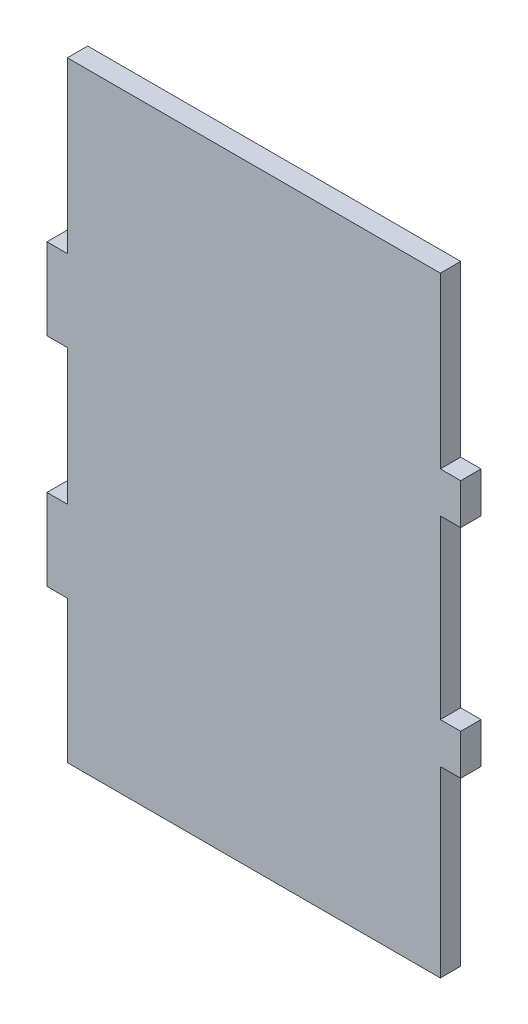
ISO-10303-21;
HEADER;
FILE_DESCRIPTION(('STEP AP214'),'2;1');
FILE_NAME('part.step','',(''),(''),'','','');
FILE_SCHEMA(('AUTOMOTIVE_DESIGN { 1 0 10303 214 1 1 1 1 }'));
ENDSEC;
DATA;
#1=APPLICATION_CONTEXT('core data for automotive mechanical design processes');
#2=APPLICATION_PROTOCOL_DEFINITION('international standard','automotive_design',2000,#1);
#3=PRODUCT_CONTEXT('',#1,'mechanical');
#4=PRODUCT('Part','Part','',(#3));
#5=PRODUCT_RELATED_PRODUCT_CATEGORY('part','',(#4));
#6=PRODUCT_DEFINITION_FORMATION('','',#4);
#7=PRODUCT_DEFINITION_CONTEXT('part definition',#1,'design');
#8=PRODUCT_DEFINITION('design','',#6,#7);
#9=PRODUCT_DEFINITION_SHAPE('','',#8);
#10=(LENGTH_UNIT() NAMED_UNIT(*) SI_UNIT(.MILLI.,.METRE.));
#11=(NAMED_UNIT(*) PLANE_ANGLE_UNIT() SI_UNIT($,.RADIAN.));
#12=(NAMED_UNIT(*) SI_UNIT($,.STERADIAN.) SOLID_ANGLE_UNIT());
#13=UNCERTAINTY_MEASURE_WITH_UNIT(LENGTH_MEASURE(1.E-05),#10,'distance_accuracy_value','');
#14=(GEOMETRIC_REPRESENTATION_CONTEXT(3) GLOBAL_UNCERTAINTY_ASSIGNED_CONTEXT((#13)) GLOBAL_UNIT_ASSIGNED_CONTEXT((#10,
#11,#12)) REPRESENTATION_CONTEXT('',''));
#15=CARTESIAN_POINT('',(0.,0.,0.));
#16=DIRECTION('',(0.,0.,1.));
#17=DIRECTION('',(1.,0.,0.));
#18=AXIS2_PLACEMENT_3D('',#15,#16,#17);
#19=CARTESIAN_POINT('',(0.,-25.,3.));
#20=DIRECTION('',(0.,-1.,0.));
#21=DIRECTION('',(1.,0.,0.));
#22=AXIS2_PLACEMENT_3D('',#19,#20,#21);
#23=PLANE('',#22);
#24=DIRECTION('',(-1.,0.,0.));
#25=VECTOR('',#24,1.);
#26=CARTESIAN_POINT('',(0.,-25.,0.));
#27=LINE('',#26,#25);
#28=CARTESIAN_POINT('',(0.,-25.,0.));
#29=VERTEX_POINT('',#28);
#30=CARTESIAN_POINT('',(-3.,-25.,0.));
#31=VERTEX_POINT('',#30);
#32=EDGE_CURVE('E207',#29,#31,#27,.T.);
#33=ORIENTED_EDGE('',*,*,#32,.T.);
#34=DIRECTION('',(0.,0.,-1.));
#35=VECTOR('',#34,1.);
#36=CARTESIAN_POINT('',(-3.,-25.,3.));
#37=LINE('',#36,#35);
#38=CARTESIAN_POINT('',(-3.,-25.,3.));
#39=VERTEX_POINT('',#38);
#40=EDGE_CURVE('E11',#39,#31,#37,.T.);
#41=ORIENTED_EDGE('',*,*,#40,.F.);
#42=DIRECTION('',(-1.,0.,0.));
#43=VECTOR('',#42,1.);
#44=CARTESIAN_POINT('',(0.,-25.,3.));
#45=LINE('',#44,#43);
#46=CARTESIAN_POINT('',(0.,-25.,3.));
#47=VERTEX_POINT('',#46);
#48=EDGE_CURVE('E245',#47,#39,#45,.T.);
#49=ORIENTED_EDGE('',*,*,#48,.F.);
#50=DIRECTION('',(0.,0.,-1.));
#51=VECTOR('',#50,1.);
#52=CARTESIAN_POINT('',(0.,-25.,3.));
#53=LINE('',#52,#51);
#54=EDGE_CURVE('E203',#47,#29,#53,.T.);
#55=ORIENTED_EDGE('',*,*,#54,.T.);
#56=EDGE_LOOP('',(#33,#41,#49,#55));
#57=FACE_BOUND('',#56,.T.);
#58=ADVANCED_FACE('F39',(#57),#23,.F.);
#59=CARTESIAN_POINT('',(-3.,-25.,3.));
#60=DIRECTION('',(1.,0.,0.));
#61=DIRECTION('',(0.,1.,0.));
#62=AXIS2_PLACEMENT_3D('',#59,#60,#61);
#63=PLANE('',#62);
#64=DIRECTION('',(0.,-1.,0.));
#65=VECTOR('',#64,1.);
#66=CARTESIAN_POINT('',(-3.,-25.,0.));
#67=LINE('',#66,#65);
#68=CARTESIAN_POINT('',(-3.,-37.,0.));
#69=VERTEX_POINT('',#68);
#70=EDGE_CURVE('E210',#31,#69,#67,.T.);
#71=ORIENTED_EDGE('',*,*,#70,.T.);
#72=DIRECTION('',(0.,0.,-1.));
#73=VECTOR('',#72,1.);
#74=CARTESIAN_POINT('',(-3.,-37.,3.));
#75=LINE('',#74,#73);
#76=CARTESIAN_POINT('',(-3.,-37.,3.));
#77=VERTEX_POINT('',#76);
#78=EDGE_CURVE('E47',#77,#69,#75,.T.);
#79=ORIENTED_EDGE('',*,*,#78,.F.);
#80=DIRECTION('',(0.,-1.,0.));
#81=VECTOR('',#80,1.);
#82=CARTESIAN_POINT('',(-3.,-25.,3.));
#83=LINE('',#82,#81);
#84=EDGE_CURVE('E134',#39,#77,#83,.T.);
#85=ORIENTED_EDGE('',*,*,#84,.F.);
#86=ORIENTED_EDGE('',*,*,#40,.T.);
#87=EDGE_LOOP('',(#71,#79,#85,#86));
#88=FACE_BOUND('',#87,.T.);
#89=ADVANCED_FACE('F363',(#88),#63,.F.);
#90=CARTESIAN_POINT('',(0.,-37.,3.));
#91=DIRECTION('',(0.,1.,0.));
#92=DIRECTION('',(-1.,0.,0.));
#93=AXIS2_PLACEMENT_3D('',#90,#91,#92);
#94=PLANE('',#93);
#95=DIRECTION('',(1.,0.,0.));
#96=VECTOR('',#95,1.);
#97=CARTESIAN_POINT('',(0.,-37.,0.));
#98=LINE('',#97,#96);
#99=CARTESIAN_POINT('',(0.,-37.,0.));
#100=VERTEX_POINT('',#99);
#101=EDGE_CURVE('E212',#69,#100,#98,.T.);
#102=ORIENTED_EDGE('',*,*,#101,.T.);
#103=DIRECTION('',(0.,0.,-1.));
#104=VECTOR('',#103,1.);
#105=CARTESIAN_POINT('',(0.,-37.,3.));
#106=LINE('',#105,#104);
#107=CARTESIAN_POINT('',(0.,-37.,3.));
#108=VERTEX_POINT('',#107);
#109=EDGE_CURVE('E288',#108,#100,#106,.T.);
#110=ORIENTED_EDGE('',*,*,#109,.F.);
#111=DIRECTION('',(1.,0.,0.));
#112=VECTOR('',#111,1.);
#113=CARTESIAN_POINT('',(0.,-37.,3.));
#114=LINE('',#113,#112);
#115=EDGE_CURVE('E296',#77,#108,#114,.T.);
#116=ORIENTED_EDGE('',*,*,#115,.F.);
#117=ORIENTED_EDGE('',*,*,#78,.T.);
#118=EDGE_LOOP('',(#102,#110,#116,#117));
#119=FACE_BOUND('',#118,.T.);
#120=ADVANCED_FACE('F294',(#119),#94,.F.);
#121=CARTESIAN_POINT('',(0.,-37.,3.));
#122=DIRECTION('',(1.,0.,0.));
#123=DIRECTION('',(0.,1.,0.));
#124=AXIS2_PLACEMENT_3D('',#121,#122,#123);
#125=PLANE('',#124);
#126=DIRECTION('',(0.,-1.,0.));
#127=VECTOR('',#126,1.);
#128=CARTESIAN_POINT('',(0.,-37.,0.));
#129=LINE('',#128,#127);
#130=CARTESIAN_POINT('',(0.,-57.,0.));
#131=VERTEX_POINT('',#130);
#132=EDGE_CURVE('E214',#100,#131,#129,.T.);
#133=ORIENTED_EDGE('',*,*,#132,.T.);
#134=DIRECTION('',(0.,0.,-1.));
#135=VECTOR('',#134,1.);
#136=CARTESIAN_POINT('',(0.,-57.,3.));
#137=LINE('',#136,#135);
#138=CARTESIAN_POINT('',(0.,-57.,3.));
#139=VERTEX_POINT('',#138);
#140=EDGE_CURVE('E285',#139,#131,#137,.T.);
#141=ORIENTED_EDGE('',*,*,#140,.F.);
#142=DIRECTION('',(0.,-1.,0.));
#143=VECTOR('',#142,1.);
#144=CARTESIAN_POINT('',(0.,-37.,3.));
#145=LINE('',#144,#143);
#146=EDGE_CURVE('E314',#108,#139,#145,.T.);
#147=ORIENTED_EDGE('',*,*,#146,.F.);
#148=ORIENTED_EDGE('',*,*,#109,.T.);
#149=EDGE_LOOP('',(#133,#141,#147,#148));
#150=FACE_BOUND('',#149,.T.);
#151=ADVANCED_FACE('F305',(#150),#125,.F.);
#152=CARTESIAN_POINT('',(0.,-57.,3.));
#153=DIRECTION('',(0.,-1.,0.));
#154=DIRECTION('',(1.,0.,0.));
#155=AXIS2_PLACEMENT_3D('',#152,#153,#154);
#156=PLANE('',#155);
#157=DIRECTION('',(-1.,0.,0.));
#158=VECTOR('',#157,1.);
#159=CARTESIAN_POINT('',(0.,-57.,0.));
#160=LINE('',#159,#158);
#161=CARTESIAN_POINT('',(-3.,-57.,0.));
#162=VERTEX_POINT('',#161);
#163=EDGE_CURVE('E216',#131,#162,#160,.T.);
#164=ORIENTED_EDGE('',*,*,#163,.T.);
#165=DIRECTION('',(0.,0.,-1.));
#166=VECTOR('',#165,1.);
#167=CARTESIAN_POINT('',(-3.,-57.,3.));
#168=LINE('',#167,#166);
#169=CARTESIAN_POINT('',(-3.,-57.,3.));
#170=VERTEX_POINT('',#169);
#171=EDGE_CURVE('E282',#170,#162,#168,.T.);
#172=ORIENTED_EDGE('',*,*,#171,.F.);
#173=DIRECTION('',(-1.,0.,0.));
#174=VECTOR('',#173,1.);
#175=CARTESIAN_POINT('',(0.,-57.,3.));
#176=LINE('',#175,#174);
#177=EDGE_CURVE('E311',#139,#170,#176,.T.);
#178=ORIENTED_EDGE('',*,*,#177,.F.);
#179=ORIENTED_EDGE('',*,*,#140,.T.);
#180=EDGE_LOOP('',(#164,#172,#178,#179));
#181=FACE_BOUND('',#180,.T.);
#182=ADVANCED_FACE('F309',(#181),#156,.F.);
#183=CARTESIAN_POINT('',(-3.,-57.,3.));
#184=DIRECTION('',(1.,0.,0.));
#185=DIRECTION('',(0.,1.,0.));
#186=AXIS2_PLACEMENT_3D('',#183,#184,#185);
#187=PLANE('',#186);
#188=DIRECTION('',(0.,-1.,0.));
#189=VECTOR('',#188,1.);
#190=CARTESIAN_POINT('',(-3.,-57.,0.));
#191=LINE('',#190,#189);
#192=CARTESIAN_POINT('',(-2.99999999999999,-69.,0.));
#193=VERTEX_POINT('',#192);
#194=EDGE_CURVE('E218',#162,#193,#191,.T.);
#195=ORIENTED_EDGE('',*,*,#194,.T.);
#196=DIRECTION('',(0.,0.,-1.));
#197=VECTOR('',#196,1.);
#198=CARTESIAN_POINT('',(-2.99999999999999,-69.,3.));
#199=LINE('',#198,#197);
#200=CARTESIAN_POINT('',(-2.99999999999999,-69.,3.));
#201=VERTEX_POINT('',#200);
#202=EDGE_CURVE('E279',#201,#193,#199,.T.);
#203=ORIENTED_EDGE('',*,*,#202,.F.);
#204=DIRECTION('',(0.,-1.,0.));
#205=VECTOR('',#204,1.);
#206=CARTESIAN_POINT('',(-3.,-57.,3.));
#207=LINE('',#206,#205);
#208=EDGE_CURVE('E313',#170,#201,#207,.T.);
#209=ORIENTED_EDGE('',*,*,#208,.F.);
#210=ORIENTED_EDGE('',*,*,#171,.T.);
#211=EDGE_LOOP('',(#195,#203,#209,#210));
#212=FACE_BOUND('',#211,.T.);
#213=ADVANCED_FACE('F376',(#212),#187,.F.);
#214=CARTESIAN_POINT('',(0.,-69.,3.));
#215=DIRECTION('',(0.,1.,0.));
#216=DIRECTION('',(-1.,0.,0.));
#217=AXIS2_PLACEMENT_3D('',#214,#215,#216);
#218=PLANE('',#217);
#219=DIRECTION('',(1.,0.,0.));
#220=VECTOR('',#219,1.);
#221=CARTESIAN_POINT('',(0.,-69.,0.));
#222=LINE('',#221,#220);
#223=CARTESIAN_POINT('',(0.,-69.,0.));
#224=VERTEX_POINT('',#223);
#225=EDGE_CURVE('E220',#193,#224,#222,.T.);
#226=ORIENTED_EDGE('',*,*,#225,.T.);
#227=DIRECTION('',(0.,0.,-1.));
#228=VECTOR('',#227,1.);
#229=CARTESIAN_POINT('',(0.,-69.,3.));
#230=LINE('',#229,#228);
#231=CARTESIAN_POINT('',(0.,-69.,3.));
#232=VERTEX_POINT('',#231);
#233=EDGE_CURVE('E276',#232,#224,#230,.T.);
#234=ORIENTED_EDGE('',*,*,#233,.F.);
#235=DIRECTION('',(1.,0.,0.));
#236=VECTOR('',#235,1.);
#237=CARTESIAN_POINT('',(0.,-69.,3.));
#238=LINE('',#237,#236);
#239=EDGE_CURVE('E316',#201,#232,#238,.T.);
#240=ORIENTED_EDGE('',*,*,#239,.F.);
#241=ORIENTED_EDGE('',*,*,#202,.T.);
#242=EDGE_LOOP('',(#226,#234,#240,#241));
#243=FACE_BOUND('',#242,.T.);
#244=ADVANCED_FACE('F379',(#243),#218,.F.);
#245=CARTESIAN_POINT('',(0.,-69.,3.));
#246=DIRECTION('',(1.,0.,0.));
#247=DIRECTION('',(0.,1.,0.));
#248=AXIS2_PLACEMENT_3D('',#245,#246,#247);
#249=PLANE('',#248);
#250=DIRECTION('',(0.,-1.,0.));
#251=VECTOR('',#250,1.);
#252=CARTESIAN_POINT('',(0.,-69.,0.));
#253=LINE('',#252,#251);
#254=CARTESIAN_POINT('',(0.,-90.,0.));
#255=VERTEX_POINT('',#254);
#256=EDGE_CURVE('E222',#224,#255,#253,.T.);
#257=ORIENTED_EDGE('',*,*,#256,.T.);
#258=DIRECTION('',(0.,0.,-1.));
#259=VECTOR('',#258,1.);
#260=CARTESIAN_POINT('',(0.,-90.,3.));
#261=LINE('',#260,#259);
#262=CARTESIAN_POINT('',(0.,-90.,3.));
#263=VERTEX_POINT('',#262);
#264=EDGE_CURVE('E273',#263,#255,#261,.T.);
#265=ORIENTED_EDGE('',*,*,#264,.F.);
#266=DIRECTION('',(0.,-1.,0.));
#267=VECTOR('',#266,1.);
#268=CARTESIAN_POINT('',(0.,-69.,3.));
#269=LINE('',#268,#267);
#270=EDGE_CURVE('E322',#232,#263,#269,.T.);
#271=ORIENTED_EDGE('',*,*,#270,.F.);
#272=ORIENTED_EDGE('',*,*,#233,.T.);
#273=EDGE_LOOP('',(#257,#265,#271,#272));
#274=FACE_BOUND('',#273,.T.);
#275=ADVANCED_FACE('F383',(#274),#249,.F.);
#276=CARTESIAN_POINT('',(0.,-90.,3.));
#277=DIRECTION('',(0.,1.,0.));
#278=DIRECTION('',(0.,0.,1.));
#279=AXIS2_PLACEMENT_3D('',#276,#277,#278);
#280=PLANE('',#279);
#281=DIRECTION('',(1.,0.,0.));
#282=VECTOR('',#281,1.);
#283=CARTESIAN_POINT('',(0.,-90.,0.));
#284=LINE('',#283,#282);
#285=CARTESIAN_POINT('',(55.,-90.,0.));
#286=VERTEX_POINT('',#285);
#287=EDGE_CURVE('E224',#255,#286,#284,.T.);
#288=ORIENTED_EDGE('',*,*,#287,.T.);
#289=DIRECTION('',(0.,0.,-1.));
#290=VECTOR('',#289,1.);
#291=CARTESIAN_POINT('',(55.,-90.,3.));
#292=LINE('',#291,#290);
#293=CARTESIAN_POINT('',(55.,-90.,3.));
#294=VERTEX_POINT('',#293);
#295=EDGE_CURVE('E270',#294,#286,#292,.T.);
#296=ORIENTED_EDGE('',*,*,#295,.F.);
#297=DIRECTION('',(1.,0.,0.));
#298=VECTOR('',#297,1.);
#299=CARTESIAN_POINT('',(0.,-90.,3.));
#300=LINE('',#299,#298);
#301=EDGE_CURVE('E324',#263,#294,#300,.T.);
#302=ORIENTED_EDGE('',*,*,#301,.F.);
#303=ORIENTED_EDGE('',*,*,#264,.T.);
#304=EDGE_LOOP('',(#288,#296,#302,#303));
#305=FACE_BOUND('',#304,.T.);
#306=ADVANCED_FACE('F387',(#305),#280,.F.);
#307=CARTESIAN_POINT('',(55.,-63.,3.));
#308=DIRECTION('',(-1.,0.,0.));
#309=DIRECTION('',(0.,0.,1.));
#310=AXIS2_PLACEMENT_3D('',#307,#308,#309);
#311=PLANE('',#310);
#312=DIRECTION('',(0.,1.,0.));
#313=VECTOR('',#312,1.);
#314=CARTESIAN_POINT('',(55.,-63.,0.));
#315=LINE('',#314,#313);
#316=CARTESIAN_POINT('',(55.,-63.,0.));
#317=VERTEX_POINT('',#316);
#318=EDGE_CURVE('E226',#286,#317,#315,.T.);
#319=ORIENTED_EDGE('',*,*,#318,.T.);
#320=DIRECTION('',(0.,0.,-1.));
#321=VECTOR('',#320,1.);
#322=CARTESIAN_POINT('',(55.,-63.,3.));
#323=LINE('',#322,#321);
#324=CARTESIAN_POINT('',(55.,-63.,3.));
#325=VERTEX_POINT('',#324);
#326=EDGE_CURVE('E267',#325,#317,#323,.T.);
#327=ORIENTED_EDGE('',*,*,#326,.F.);
#328=DIRECTION('',(0.,1.,0.));
#329=VECTOR('',#328,1.);
#330=CARTESIAN_POINT('',(55.,-63.,3.));
#331=LINE('',#330,#329);
#332=EDGE_CURVE('E326',#294,#325,#331,.T.);
#333=ORIENTED_EDGE('',*,*,#332,.F.);
#334=ORIENTED_EDGE('',*,*,#295,.T.);
#335=EDGE_LOOP('',(#319,#327,#333,#334));
#336=FACE_BOUND('',#335,.T.);
#337=ADVANCED_FACE('F391',(#336),#311,.F.);
#338=CARTESIAN_POINT('',(55.,-63.,3.));
#339=DIRECTION('',(0.,1.,0.));
#340=DIRECTION('',(0.,0.,1.));
#341=AXIS2_PLACEMENT_3D('',#338,#339,#340);
#342=PLANE('',#341);
#343=DIRECTION('',(1.,0.,0.));
#344=VECTOR('',#343,1.);
#345=CARTESIAN_POINT('',(55.,-63.,0.));
#346=LINE('',#345,#344);
#347=CARTESIAN_POINT('',(58.,-63.,0.));
#348=VERTEX_POINT('',#347);
#349=EDGE_CURVE('E228',#317,#348,#346,.T.);
#350=ORIENTED_EDGE('',*,*,#349,.T.);
#351=DIRECTION('',(0.,0.,-1.));
#352=VECTOR('',#351,1.);
#353=CARTESIAN_POINT('',(58.,-63.,3.));
#354=LINE('',#353,#352);
#355=CARTESIAN_POINT('',(58.,-63.,3.));
#356=VERTEX_POINT('',#355);
#357=EDGE_CURVE('E264',#356,#348,#354,.T.);
#358=ORIENTED_EDGE('',*,*,#357,.F.);
#359=DIRECTION('',(1.,0.,0.));
#360=VECTOR('',#359,1.);
#361=CARTESIAN_POINT('',(55.,-63.,3.));
#362=LINE('',#361,#360);
#363=EDGE_CURVE('E328',#325,#356,#362,.T.);
#364=ORIENTED_EDGE('',*,*,#363,.F.);
#365=ORIENTED_EDGE('',*,*,#326,.T.);
#366=EDGE_LOOP('',(#350,#358,#364,#365));
#367=FACE_BOUND('',#366,.T.);
#368=ADVANCED_FACE('F395',(#367),#342,.F.);
#369=CARTESIAN_POINT('',(58.,-57.,3.));
#370=DIRECTION('',(-1.,0.,0.));
#371=DIRECTION('',(0.,0.,1.));
#372=AXIS2_PLACEMENT_3D('',#369,#370,#371);
#373=PLANE('',#372);
#374=DIRECTION('',(0.,1.,0.));
#375=VECTOR('',#374,1.);
#376=CARTESIAN_POINT('',(58.,-57.,0.));
#377=LINE('',#376,#375);
#378=CARTESIAN_POINT('',(58.,-57.,0.));
#379=VERTEX_POINT('',#378);
#380=EDGE_CURVE('E230',#348,#379,#377,.T.);
#381=ORIENTED_EDGE('',*,*,#380,.T.);
#382=DIRECTION('',(0.,0.,-1.));
#383=VECTOR('',#382,1.);
#384=CARTESIAN_POINT('',(58.,-57.,3.));
#385=LINE('',#384,#383);
#386=CARTESIAN_POINT('',(58.,-57.,3.));
#387=VERTEX_POINT('',#386);
#388=EDGE_CURVE('E261',#387,#379,#385,.T.);
#389=ORIENTED_EDGE('',*,*,#388,.F.);
#390=DIRECTION('',(0.,1.,0.));
#391=VECTOR('',#390,1.);
#392=CARTESIAN_POINT('',(58.,-57.,3.));
#393=LINE('',#392,#391);
#394=EDGE_CURVE('E330',#356,#387,#393,.T.);
#395=ORIENTED_EDGE('',*,*,#394,.F.);
#396=ORIENTED_EDGE('',*,*,#357,.T.);
#397=EDGE_LOOP('',(#381,#389,#395,#396));
#398=FACE_BOUND('',#397,.T.);
#399=ADVANCED_FACE('F399',(#398),#373,.F.);
#400=CARTESIAN_POINT('',(55.,-57.,3.));
#401=DIRECTION('',(0.,-1.,0.));
#402=DIRECTION('',(0.,0.,-1.));
#403=AXIS2_PLACEMENT_3D('',#400,#401,#402);
#404=PLANE('',#403);
#405=DIRECTION('',(-1.,0.,0.));
#406=VECTOR('',#405,1.);
#407=CARTESIAN_POINT('',(55.,-57.,0.));
#408=LINE('',#407,#406);
#409=CARTESIAN_POINT('',(55.,-57.,0.));
#410=VERTEX_POINT('',#409);
#411=EDGE_CURVE('E232',#379,#410,#408,.T.);
#412=ORIENTED_EDGE('',*,*,#411,.T.);
#413=DIRECTION('',(0.,0.,-1.));
#414=VECTOR('',#413,1.);
#415=CARTESIAN_POINT('',(55.,-57.,3.));
#416=LINE('',#415,#414);
#417=CARTESIAN_POINT('',(55.,-57.,3.));
#418=VERTEX_POINT('',#417);
#419=EDGE_CURVE('E258',#418,#410,#416,.T.);
#420=ORIENTED_EDGE('',*,*,#419,.F.);
#421=DIRECTION('',(-1.,0.,0.));
#422=VECTOR('',#421,1.);
#423=CARTESIAN_POINT('',(55.,-57.,3.));
#424=LINE('',#423,#422);
#425=EDGE_CURVE('E332',#387,#418,#424,.T.);
#426=ORIENTED_EDGE('',*,*,#425,.F.);
#427=ORIENTED_EDGE('',*,*,#388,.T.);
#428=EDGE_LOOP('',(#412,#420,#426,#427));
#429=FACE_BOUND('',#428,.T.);
#430=ADVANCED_FACE('F403',(#429),#404,.F.);
#431=CARTESIAN_POINT('',(55.,-31.,3.));
#432=DIRECTION('',(-1.,0.,0.));
#433=DIRECTION('',(0.,0.,1.));
#434=AXIS2_PLACEMENT_3D('',#431,#432,#433);
#435=PLANE('',#434);
#436=DIRECTION('',(0.,1.,0.));
#437=VECTOR('',#436,1.);
#438=CARTESIAN_POINT('',(55.,-31.,0.));
#439=LINE('',#438,#437);
#440=CARTESIAN_POINT('',(55.,-31.,0.));
#441=VERTEX_POINT('',#440);
#442=EDGE_CURVE('E234',#410,#441,#439,.T.);
#443=ORIENTED_EDGE('',*,*,#442,.T.);
#444=DIRECTION('',(0.,0.,-1.));
#445=VECTOR('',#444,1.);
#446=CARTESIAN_POINT('',(55.,-31.,3.));
#447=LINE('',#446,#445);
#448=CARTESIAN_POINT('',(55.,-31.,3.));
#449=VERTEX_POINT('',#448);
#450=EDGE_CURVE('E255',#449,#441,#447,.T.);
#451=ORIENTED_EDGE('',*,*,#450,.F.);
#452=DIRECTION('',(0.,1.,0.));
#453=VECTOR('',#452,1.);
#454=CARTESIAN_POINT('',(55.,-31.,3.));
#455=LINE('',#454,#453);
#456=EDGE_CURVE('E334',#418,#449,#455,.T.);
#457=ORIENTED_EDGE('',*,*,#456,.F.);
#458=ORIENTED_EDGE('',*,*,#419,.T.);
#459=EDGE_LOOP('',(#443,#451,#457,#458));
#460=FACE_BOUND('',#459,.T.);
#461=ADVANCED_FACE('F407',(#460),#435,.F.);
#462=CARTESIAN_POINT('',(55.,-31.,3.));
#463=DIRECTION('',(0.,1.,0.));
#464=DIRECTION('',(0.,0.,1.));
#465=AXIS2_PLACEMENT_3D('',#462,#463,#464);
#466=PLANE('',#465);
#467=DIRECTION('',(1.,0.,0.));
#468=VECTOR('',#467,1.);
#469=CARTESIAN_POINT('',(55.,-31.,0.));
#470=LINE('',#469,#468);
#471=CARTESIAN_POINT('',(58.,-31.,0.));
#472=VERTEX_POINT('',#471);
#473=EDGE_CURVE('E236',#441,#472,#470,.T.);
#474=ORIENTED_EDGE('',*,*,#473,.T.);
#475=DIRECTION('',(0.,0.,-1.));
#476=VECTOR('',#475,1.);
#477=CARTESIAN_POINT('',(58.,-31.,3.));
#478=LINE('',#477,#476);
#479=CARTESIAN_POINT('',(58.,-31.,3.));
#480=VERTEX_POINT('',#479);
#481=EDGE_CURVE('E252',#480,#472,#478,.T.);
#482=ORIENTED_EDGE('',*,*,#481,.F.);
#483=DIRECTION('',(1.,0.,0.));
#484=VECTOR('',#483,1.);
#485=CARTESIAN_POINT('',(55.,-31.,3.));
#486=LINE('',#485,#484);
#487=EDGE_CURVE('E336',#449,#480,#486,.T.);
#488=ORIENTED_EDGE('',*,*,#487,.F.);
#489=ORIENTED_EDGE('',*,*,#450,.T.);
#490=EDGE_LOOP('',(#474,#482,#488,#489));
#491=FACE_BOUND('',#490,.T.);
#492=ADVANCED_FACE('F411',(#491),#466,.F.);
#493=CARTESIAN_POINT('',(58.,-25.,3.));
#494=DIRECTION('',(-1.,0.,0.));
#495=DIRECTION('',(0.,0.,1.));
#496=AXIS2_PLACEMENT_3D('',#493,#494,#495);
#497=PLANE('',#496);
#498=DIRECTION('',(0.,1.,0.));
#499=VECTOR('',#498,1.);
#500=CARTESIAN_POINT('',(58.,-25.,0.));
#501=LINE('',#500,#499);
#502=CARTESIAN_POINT('',(58.,-25.,0.));
#503=VERTEX_POINT('',#502);
#504=EDGE_CURVE('E238',#472,#503,#501,.T.);
#505=ORIENTED_EDGE('',*,*,#504,.T.);
#506=DIRECTION('',(0.,0.,-1.));
#507=VECTOR('',#506,1.);
#508=CARTESIAN_POINT('',(58.,-25.,3.));
#509=LINE('',#508,#507);
#510=CARTESIAN_POINT('',(58.,-25.,3.));
#511=VERTEX_POINT('',#510);
#512=EDGE_CURVE('E249',#511,#503,#509,.T.);
#513=ORIENTED_EDGE('',*,*,#512,.F.);
#514=DIRECTION('',(0.,1.,0.));
#515=VECTOR('',#514,1.);
#516=CARTESIAN_POINT('',(58.,-25.,3.));
#517=LINE('',#516,#515);
#518=EDGE_CURVE('E338',#480,#511,#517,.T.);
#519=ORIENTED_EDGE('',*,*,#518,.F.);
#520=ORIENTED_EDGE('',*,*,#481,.T.);
#521=EDGE_LOOP('',(#505,#513,#519,#520));
#522=FACE_BOUND('',#521,.T.);
#523=ADVANCED_FACE('F344',(#522),#497,.F.);
#524=CARTESIAN_POINT('',(55.,-25.,3.));
#525=DIRECTION('',(0.,-1.,0.));
#526=DIRECTION('',(0.,0.,-1.));
#527=AXIS2_PLACEMENT_3D('',#524,#525,#526);
#528=PLANE('',#527);
#529=DIRECTION('',(-1.,0.,0.));
#530=VECTOR('',#529,1.);
#531=CARTESIAN_POINT('',(55.,-25.,0.));
#532=LINE('',#531,#530);
#533=CARTESIAN_POINT('',(55.,-25.,0.));
#534=VERTEX_POINT('',#533);
#535=EDGE_CURVE('E240',#503,#534,#532,.T.);
#536=ORIENTED_EDGE('',*,*,#535,.T.);
#537=DIRECTION('',(0.,0.,-1.));
#538=VECTOR('',#537,1.);
#539=CARTESIAN_POINT('',(55.,-25.,3.));
#540=LINE('',#539,#538);
#541=CARTESIAN_POINT('',(55.,-25.,3.));
#542=VERTEX_POINT('',#541);
#543=EDGE_CURVE('E198',#542,#534,#540,.T.);
#544=ORIENTED_EDGE('',*,*,#543,.F.);
#545=DIRECTION('',(-1.,0.,0.));
#546=VECTOR('',#545,1.);
#547=CARTESIAN_POINT('',(55.,-25.,3.));
#548=LINE('',#547,#546);
#549=EDGE_CURVE('E189',#511,#542,#548,.T.);
#550=ORIENTED_EDGE('',*,*,#549,.F.);
#551=ORIENTED_EDGE('',*,*,#512,.T.);
#552=EDGE_LOOP('',(#536,#544,#550,#551));
#553=FACE_BOUND('',#552,.T.);
#554=ADVANCED_FACE('F348',(#553),#528,.F.);
#555=CARTESIAN_POINT('',(55.,0.,3.));
#556=DIRECTION('',(-1.,0.,0.));
#557=DIRECTION('',(0.,0.,1.));
#558=AXIS2_PLACEMENT_3D('',#555,#556,#557);
#559=PLANE('',#558);
#560=DIRECTION('',(0.,1.,0.));
#561=VECTOR('',#560,1.);
#562=CARTESIAN_POINT('',(55.,0.,0.));
#563=LINE('',#562,#561);
#564=CARTESIAN_POINT('',(55.,0.,0.));
#565=VERTEX_POINT('',#564);
#566=EDGE_CURVE('E197',#534,#565,#563,.T.);
#567=ORIENTED_EDGE('',*,*,#566,.T.);
#568=DIRECTION('',(0.,0.,-1.));
#569=VECTOR('',#568,1.);
#570=CARTESIAN_POINT('',(55.,0.,3.));
#571=LINE('',#570,#569);
#572=CARTESIAN_POINT('',(55.,0.,3.));
#573=VERTEX_POINT('',#572);
#574=EDGE_CURVE('E194',#573,#565,#571,.T.);
#575=ORIENTED_EDGE('',*,*,#574,.F.);
#576=DIRECTION('',(0.,1.,0.));
#577=VECTOR('',#576,1.);
#578=CARTESIAN_POINT('',(55.,0.,3.));
#579=LINE('',#578,#577);
#580=EDGE_CURVE('E183',#542,#573,#579,.T.);
#581=ORIENTED_EDGE('',*,*,#580,.F.);
#582=ORIENTED_EDGE('',*,*,#543,.T.);
#583=EDGE_LOOP('',(#567,#575,#581,#582));
#584=FACE_BOUND('',#583,.T.);
#585=ADVANCED_FACE('F195',(#584),#559,.F.);
#586=CARTESIAN_POINT('',(0.,0.,3.));
#587=DIRECTION('',(0.,-1.,0.));
#588=DIRECTION('',(0.,0.,-1.));
#589=AXIS2_PLACEMENT_3D('',#586,#587,#588);
#590=PLANE('',#589);
#591=DIRECTION('',(-1.,0.,0.));
#592=VECTOR('',#591,1.);
#593=CARTESIAN_POINT('',(0.,0.,0.));
#594=LINE('',#593,#592);
#595=CARTESIAN_POINT('',(0.,0.,0.));
#596=VERTEX_POINT('',#595);
#597=EDGE_CURVE('E120',#565,#596,#594,.T.);
#598=ORIENTED_EDGE('',*,*,#597,.T.);
#599=DIRECTION('',(0.,0.,-1.));
#600=VECTOR('',#599,1.);
#601=CARTESIAN_POINT('',(0.,0.,3.));
#602=LINE('',#601,#600);
#603=CARTESIAN_POINT('',(0.,0.,3.));
#604=VERTEX_POINT('',#603);
#605=EDGE_CURVE('E199',#604,#596,#602,.T.);
#606=ORIENTED_EDGE('',*,*,#605,.F.);
#607=DIRECTION('',(-1.,0.,0.));
#608=VECTOR('',#607,1.);
#609=CARTESIAN_POINT('',(0.,0.,3.));
#610=LINE('',#609,#608);
#611=EDGE_CURVE('E187',#573,#604,#610,.T.);
#612=ORIENTED_EDGE('',*,*,#611,.F.);
#613=ORIENTED_EDGE('',*,*,#574,.T.);
#614=EDGE_LOOP('',(#598,#606,#612,#613));
#615=FACE_BOUND('',#614,.T.);
#616=ADVANCED_FACE('F201',(#615),#590,.F.);
#617=CARTESIAN_POINT('',(0.,0.,3.));
#618=DIRECTION('',(1.,0.,0.));
#619=DIRECTION('',(0.,1.,0.));
#620=AXIS2_PLACEMENT_3D('',#617,#618,#619);
#621=PLANE('',#620);
#622=DIRECTION('',(0.,-1.,0.));
#623=VECTOR('',#622,1.);
#624=CARTESIAN_POINT('',(0.,0.,0.));
#625=LINE('',#624,#623);
#626=EDGE_CURVE('E126',#596,#29,#625,.T.);
#627=ORIENTED_EDGE('',*,*,#626,.T.);
#628=ORIENTED_EDGE('',*,*,#54,.F.);
#629=DIRECTION('',(0.,-1.,0.));
#630=VECTOR('',#629,1.);
#631=CARTESIAN_POINT('',(0.,0.,3.));
#632=LINE('',#631,#630);
#633=EDGE_CURVE('E55',#604,#47,#632,.T.);
#634=ORIENTED_EDGE('',*,*,#633,.F.);
#635=ORIENTED_EDGE('',*,*,#605,.T.);
#636=EDGE_LOOP('',(#627,#628,#634,#635));
#637=FACE_BOUND('',#636,.T.);
#638=ADVANCED_FACE('F352',(#637),#621,.F.);
#639=CARTESIAN_POINT('',(0.,0.,3.));
#640=DIRECTION('',(0.,0.,1.));
#641=DIRECTION('',(1.,0.,0.));
#642=AXIS2_PLACEMENT_3D('',#639,#640,#641);
#643=PLANE('',#642);
#644=ORIENTED_EDGE('',*,*,#48,.T.);
#645=ORIENTED_EDGE('',*,*,#84,.T.);
#646=ORIENTED_EDGE('',*,*,#115,.T.);
#647=ORIENTED_EDGE('',*,*,#146,.T.);
#648=ORIENTED_EDGE('',*,*,#177,.T.);
#649=ORIENTED_EDGE('',*,*,#208,.T.);
#650=ORIENTED_EDGE('',*,*,#239,.T.);
#651=ORIENTED_EDGE('',*,*,#270,.T.);
#652=ORIENTED_EDGE('',*,*,#301,.T.);
#653=ORIENTED_EDGE('',*,*,#332,.T.);
#654=ORIENTED_EDGE('',*,*,#363,.T.);
#655=ORIENTED_EDGE('',*,*,#394,.T.);
#656=ORIENTED_EDGE('',*,*,#425,.T.);
#657=ORIENTED_EDGE('',*,*,#456,.T.);
#658=ORIENTED_EDGE('',*,*,#487,.T.);
#659=ORIENTED_EDGE('',*,*,#518,.T.);
#660=ORIENTED_EDGE('',*,*,#549,.T.);
#661=ORIENTED_EDGE('',*,*,#580,.T.);
#662=ORIENTED_EDGE('',*,*,#611,.T.);
#663=ORIENTED_EDGE('',*,*,#633,.T.);
#664=EDGE_LOOP('',(#644,#645,#646,#647,#648,#649,#650,#651,#652,#653,#654,#655,#656,#657,#658,
#659,#660,#661,#662,#663));
#665=FACE_BOUND('',#664,.T.);
#666=ADVANCED_FACE('F185',(#665),#643,.T.);
#667=CARTESIAN_POINT('',(0.,0.,0.));
#668=DIRECTION('',(0.,0.,1.));
#669=DIRECTION('',(1.,0.,0.));
#670=AXIS2_PLACEMENT_3D('',#667,#668,#669);
#671=PLANE('',#670);
#672=ORIENTED_EDGE('',*,*,#32,.F.);
#673=ORIENTED_EDGE('',*,*,#626,.F.);
#674=ORIENTED_EDGE('',*,*,#597,.F.);
#675=ORIENTED_EDGE('',*,*,#566,.F.);
#676=ORIENTED_EDGE('',*,*,#535,.F.);
#677=ORIENTED_EDGE('',*,*,#504,.F.);
#678=ORIENTED_EDGE('',*,*,#473,.F.);
#679=ORIENTED_EDGE('',*,*,#442,.F.);
#680=ORIENTED_EDGE('',*,*,#411,.F.);
#681=ORIENTED_EDGE('',*,*,#380,.F.);
#682=ORIENTED_EDGE('',*,*,#349,.F.);
#683=ORIENTED_EDGE('',*,*,#318,.F.);
#684=ORIENTED_EDGE('',*,*,#287,.F.);
#685=ORIENTED_EDGE('',*,*,#256,.F.);
#686=ORIENTED_EDGE('',*,*,#225,.F.);
#687=ORIENTED_EDGE('',*,*,#194,.F.);
#688=ORIENTED_EDGE('',*,*,#163,.F.);
#689=ORIENTED_EDGE('',*,*,#132,.F.);
#690=ORIENTED_EDGE('',*,*,#101,.F.);
#691=ORIENTED_EDGE('',*,*,#70,.F.);
#692=EDGE_LOOP('',(#672,#673,#674,#675,#676,#677,#678,#679,#680,#681,#682,#683,#684,#685,#686,
#687,#688,#689,#690,#691));
#693=FACE_BOUND('',#692,.T.);
#694=ADVANCED_FACE('F300',(#693),#671,.F.);
#695=CLOSED_SHELL('',(#58,#89,#120,#151,#182,#213,#244,#275,#306,#337,#368,#399,#430,#461,#492,
#523,#554,#585,#616,#638,#666,#694));
#696=MANIFOLD_SOLID_BREP('B2',#695);
#697=ADVANCED_BREP_SHAPE_REPRESENTATION('',(#18,#696),#14);
#698=SHAPE_DEFINITION_REPRESENTATION(#9,#697);
ENDSEC;
END-ISO-10303-21;
